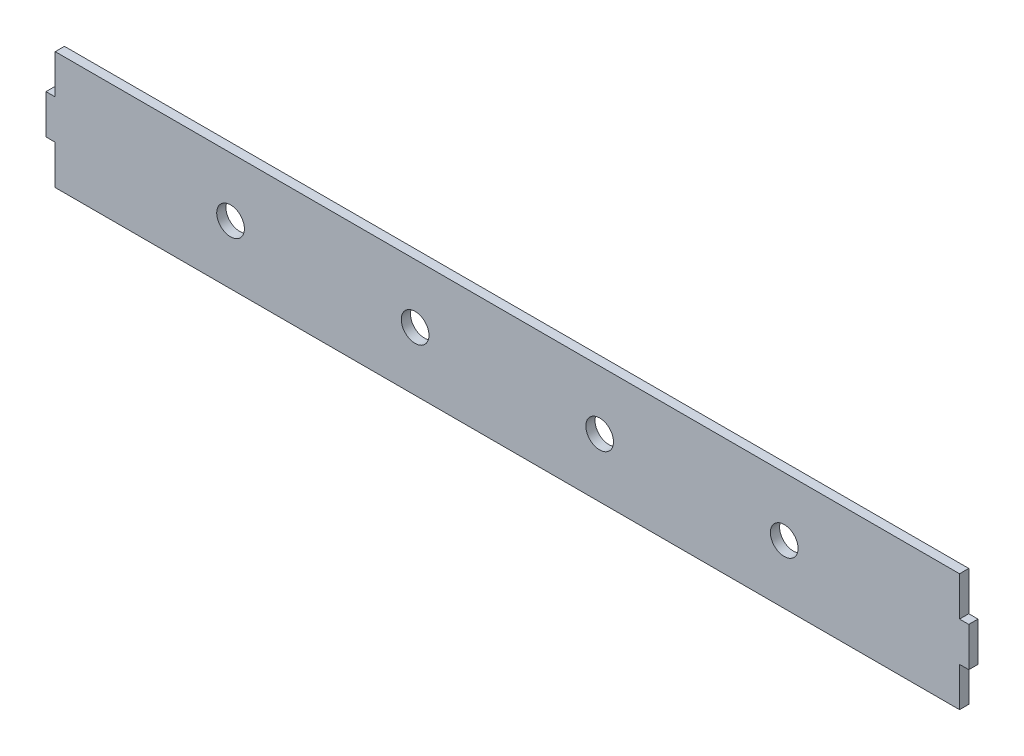
ISO-10303-21;
HEADER;
FILE_DESCRIPTION(('STEP AP214'),'2;1');
FILE_NAME('part.step','',(''),(''),'','','');
FILE_SCHEMA(('AUTOMOTIVE_DESIGN { 1 0 10303 214 1 1 1 1 }'));
ENDSEC;
DATA;
#1=APPLICATION_CONTEXT('core data for automotive mechanical design processes');
#2=APPLICATION_PROTOCOL_DEFINITION('international standard','automotive_design',2000,#1);
#3=PRODUCT_CONTEXT('',#1,'mechanical');
#4=PRODUCT('Part','Part','',(#3));
#5=PRODUCT_RELATED_PRODUCT_CATEGORY('part','',(#4));
#6=PRODUCT_DEFINITION_FORMATION('','',#4);
#7=PRODUCT_DEFINITION_CONTEXT('part definition',#1,'design');
#8=PRODUCT_DEFINITION('design','',#6,#7);
#9=PRODUCT_DEFINITION_SHAPE('','',#8);
#10=(LENGTH_UNIT() NAMED_UNIT(*) SI_UNIT(.MILLI.,.METRE.));
#11=(NAMED_UNIT(*) PLANE_ANGLE_UNIT() SI_UNIT($,.RADIAN.));
#12=(NAMED_UNIT(*) SI_UNIT($,.STERADIAN.) SOLID_ANGLE_UNIT());
#13=UNCERTAINTY_MEASURE_WITH_UNIT(LENGTH_MEASURE(1.E-05),#10,'distance_accuracy_value','');
#14=(GEOMETRIC_REPRESENTATION_CONTEXT(3) GLOBAL_UNCERTAINTY_ASSIGNED_CONTEXT((#13)) GLOBAL_UNIT_ASSIGNED_CONTEXT((#10,
#11,#12)) REPRESENTATION_CONTEXT('',''));
#15=CARTESIAN_POINT('',(0.,0.,0.));
#16=DIRECTION('',(0.,0.,1.));
#17=DIRECTION('',(1.,0.,0.));
#18=AXIS2_PLACEMENT_3D('',#15,#16,#17);
#19=CARTESIAN_POINT('',(0.,0.,5.));
#20=DIRECTION('',(0.,0.,-1.));
#21=DIRECTION('',(-1.,0.,0.));
#22=AXIS2_PLACEMENT_3D('',#19,#20,#21);
#23=PLANE('',#22);
#24=DIRECTION('',(1.,0.,0.));
#25=VECTOR('',#24,1.);
#26=CARTESIAN_POINT('',(490.,0.,5.));
#27=LINE('',#26,#25);
#28=CARTESIAN_POINT('',(0.,0.,5.));
#29=VERTEX_POINT('',#28);
#30=CARTESIAN_POINT('',(490.,0.,5.));
#31=VERTEX_POINT('',#30);
#32=EDGE_CURVE('E180',#29,#31,#27,.T.);
#33=ORIENTED_EDGE('',*,*,#32,.T.);
#34=DIRECTION('',(0.,1.,0.));
#35=VECTOR('',#34,1.);
#36=CARTESIAN_POINT('',(490.,21.2666666666667,5.));
#37=LINE('',#36,#35);
#38=CARTESIAN_POINT('',(490.,21.2666666666667,5.));
#39=VERTEX_POINT('',#38);
#40=EDGE_CURVE('E108',#31,#39,#37,.T.);
#41=ORIENTED_EDGE('',*,*,#40,.T.);
#42=DIRECTION('',(1.,0.,0.));
#43=VECTOR('',#42,1.);
#44=CARTESIAN_POINT('',(495.,21.2666666666667,5.));
#45=LINE('',#44,#43);
#46=CARTESIAN_POINT('',(495.,21.2666666666667,5.));
#47=VERTEX_POINT('',#46);
#48=EDGE_CURVE('E207',#39,#47,#45,.T.);
#49=ORIENTED_EDGE('',*,*,#48,.T.);
#50=DIRECTION('',(0.,1.,0.));
#51=VECTOR('',#50,1.);
#52=CARTESIAN_POINT('',(495.,42.5333333333333,5.));
#53=LINE('',#52,#51);
#54=CARTESIAN_POINT('',(495.,42.5333333333333,5.));
#55=VERTEX_POINT('',#54);
#56=EDGE_CURVE('E226',#47,#55,#53,.T.);
#57=ORIENTED_EDGE('',*,*,#56,.T.);
#58=DIRECTION('',(-1.,0.,0.));
#59=VECTOR('',#58,1.);
#60=CARTESIAN_POINT('',(490.,42.5333333333333,5.));
#61=LINE('',#60,#59);
#62=CARTESIAN_POINT('',(490.,42.5333333333333,5.));
#63=VERTEX_POINT('',#62);
#64=EDGE_CURVE('E223',#55,#63,#61,.T.);
#65=ORIENTED_EDGE('',*,*,#64,.T.);
#66=DIRECTION('',(0.,1.,0.));
#67=VECTOR('',#66,1.);
#68=CARTESIAN_POINT('',(490.,63.7999999999999,5.));
#69=LINE('',#68,#67);
#70=CARTESIAN_POINT('',(490.,63.7999999999999,5.));
#71=VERTEX_POINT('',#70);
#72=EDGE_CURVE('E225',#63,#71,#69,.T.);
#73=ORIENTED_EDGE('',*,*,#72,.T.);
#74=DIRECTION('',(-1.,0.,0.));
#75=VECTOR('',#74,1.);
#76=CARTESIAN_POINT('',(0.,63.7999999999999,5.));
#77=LINE('',#76,#75);
#78=CARTESIAN_POINT('',(0.,63.7999999999999,5.));
#79=VERTEX_POINT('',#78);
#80=EDGE_CURVE('E228',#71,#79,#77,.T.);
#81=ORIENTED_EDGE('',*,*,#80,.T.);
#82=DIRECTION('',(0.,-1.,0.));
#83=VECTOR('',#82,1.);
#84=CARTESIAN_POINT('',(0.,42.5333333333333,5.));
#85=LINE('',#84,#83);
#86=CARTESIAN_POINT('',(0.,42.5333333333333,5.));
#87=VERTEX_POINT('',#86);
#88=EDGE_CURVE('E234',#79,#87,#85,.T.);
#89=ORIENTED_EDGE('',*,*,#88,.T.);
#90=DIRECTION('',(-1.,0.,0.));
#91=VECTOR('',#90,1.);
#92=CARTESIAN_POINT('',(-5.,42.5333333333333,5.));
#93=LINE('',#92,#91);
#94=CARTESIAN_POINT('',(-5.,42.5333333333333,5.));
#95=VERTEX_POINT('',#94);
#96=EDGE_CURVE('E139',#87,#95,#93,.T.);
#97=ORIENTED_EDGE('',*,*,#96,.T.);
#98=DIRECTION('',(0.,-1.,0.));
#99=VECTOR('',#98,1.);
#100=CARTESIAN_POINT('',(-5.,21.2666666666667,5.));
#101=LINE('',#100,#99);
#102=CARTESIAN_POINT('',(-5.,21.2666666666667,5.));
#103=VERTEX_POINT('',#102);
#104=EDGE_CURVE('E133',#95,#103,#101,.T.);
#105=ORIENTED_EDGE('',*,*,#104,.T.);
#106=DIRECTION('',(1.,0.,0.));
#107=VECTOR('',#106,1.);
#108=CARTESIAN_POINT('',(0.,21.2666666666667,5.));
#109=LINE('',#108,#107);
#110=CARTESIAN_POINT('',(0.,21.2666666666667,5.));
#111=VERTEX_POINT('',#110);
#112=EDGE_CURVE('E137',#103,#111,#109,.T.);
#113=ORIENTED_EDGE('',*,*,#112,.T.);
#114=DIRECTION('',(0.,-1.,0.));
#115=VECTOR('',#114,1.);
#116=CARTESIAN_POINT('',(0.,0.,5.));
#117=LINE('',#116,#115);
#118=EDGE_CURVE('E53',#111,#29,#117,.T.);
#119=ORIENTED_EDGE('',*,*,#118,.T.);
#120=EDGE_LOOP('',(#33,#41,#49,#57,#65,#73,#81,#89,#97,#105,#113,#119));
#121=FACE_BOUND('',#120,.T.);
#122=CARTESIAN_POINT('',(95.,31.9,5.));
#123=DIRECTION('',(0.,0.,1.));
#124=DIRECTION('',(1.,0.,0.));
#125=AXIS2_PLACEMENT_3D('',#122,#123,#124);
#126=CIRCLE('',#125,7.50000000000001);
#127=CARTESIAN_POINT('',(102.5,31.9,5.));
#128=VERTEX_POINT('',#127);
#129=EDGE_CURVE('E161',#128,#128,#126,.T.);
#130=ORIENTED_EDGE('',*,*,#129,.F.);
#131=EDGE_LOOP('',(#130));
#132=FACE_BOUND('',#131,.T.);
#133=CARTESIAN_POINT('',(195.,31.9,5.));
#134=DIRECTION('',(0.,0.,1.));
#135=DIRECTION('',(1.,0.,0.));
#136=AXIS2_PLACEMENT_3D('',#133,#134,#135);
#137=CIRCLE('',#136,7.50000000000001);
#138=CARTESIAN_POINT('',(202.5,31.9,5.));
#139=VERTEX_POINT('',#138);
#140=EDGE_CURVE('E298',#139,#139,#137,.T.);
#141=ORIENTED_EDGE('',*,*,#140,.F.);
#142=EDGE_LOOP('',(#141));
#143=FACE_BOUND('',#142,.T.);
#144=CARTESIAN_POINT('',(295.,31.9,5.));
#145=DIRECTION('',(0.,0.,1.));
#146=DIRECTION('',(1.,0.,0.));
#147=AXIS2_PLACEMENT_3D('',#144,#145,#146);
#148=CIRCLE('',#147,7.50000000000001);
#149=CARTESIAN_POINT('',(302.5,31.9,5.));
#150=VERTEX_POINT('',#149);
#151=EDGE_CURVE('E292',#150,#150,#148,.T.);
#152=ORIENTED_EDGE('',*,*,#151,.F.);
#153=EDGE_LOOP('',(#152));
#154=FACE_BOUND('',#153,.T.);
#155=CARTESIAN_POINT('',(395.,31.9,5.));
#156=DIRECTION('',(0.,0.,1.));
#157=DIRECTION('',(1.,0.,0.));
#158=AXIS2_PLACEMENT_3D('',#155,#156,#157);
#159=CIRCLE('',#158,7.50000000000001);
#160=CARTESIAN_POINT('',(402.5,31.9,5.));
#161=VERTEX_POINT('',#160);
#162=EDGE_CURVE('E283',#161,#161,#159,.T.);
#163=ORIENTED_EDGE('',*,*,#162,.F.);
#164=EDGE_LOOP('',(#163));
#165=FACE_BOUND('',#164,.T.);
#166=ADVANCED_FACE('F36',(#121,#132,#143,#154,#165),#23,.F.);
#167=CARTESIAN_POINT('',(0.,0.,0.));
#168=DIRECTION('',(0.,0.,-1.));
#169=DIRECTION('',(-1.,0.,0.));
#170=AXIS2_PLACEMENT_3D('',#167,#168,#169);
#171=PLANE('',#170);
#172=CARTESIAN_POINT('',(295.,31.9,0.));
#173=DIRECTION('',(0.,0.,1.));
#174=DIRECTION('',(1.,0.,0.));
#175=AXIS2_PLACEMENT_3D('',#172,#173,#174);
#176=CIRCLE('',#175,7.50000000000001);
#177=CARTESIAN_POINT('',(302.5,31.9,0.));
#178=VERTEX_POINT('',#177);
#179=EDGE_CURVE('E289',#178,#178,#176,.T.);
#180=ORIENTED_EDGE('',*,*,#179,.T.);
#181=EDGE_LOOP('',(#180));
#182=FACE_BOUND('',#181,.T.);
#183=CARTESIAN_POINT('',(95.,31.9,0.));
#184=DIRECTION('',(0.,0.,1.));
#185=DIRECTION('',(1.,0.,0.));
#186=AXIS2_PLACEMENT_3D('',#183,#184,#185);
#187=CIRCLE('',#186,7.50000000000001);
#188=CARTESIAN_POINT('',(102.5,31.9,0.));
#189=VERTEX_POINT('',#188);
#190=EDGE_CURVE('E301',#189,#189,#187,.T.);
#191=ORIENTED_EDGE('',*,*,#190,.T.);
#192=EDGE_LOOP('',(#191));
#193=FACE_BOUND('',#192,.T.);
#194=DIRECTION('',(1.,0.,0.));
#195=VECTOR('',#194,1.);
#196=CARTESIAN_POINT('',(490.,0.,0.));
#197=LINE('',#196,#195);
#198=CARTESIAN_POINT('',(0.,0.,0.));
#199=VERTEX_POINT('',#198);
#200=CARTESIAN_POINT('',(490.,0.,0.));
#201=VERTEX_POINT('',#200);
#202=EDGE_CURVE('E157',#199,#201,#197,.T.);
#203=ORIENTED_EDGE('',*,*,#202,.F.);
#204=DIRECTION('',(0.,-1.,0.));
#205=VECTOR('',#204,1.);
#206=CARTESIAN_POINT('',(0.,0.,0.));
#207=LINE('',#206,#205);
#208=CARTESIAN_POINT('',(0.,21.2666666666667,0.));
#209=VERTEX_POINT('',#208);
#210=EDGE_CURVE('E100',#209,#199,#207,.T.);
#211=ORIENTED_EDGE('',*,*,#210,.F.);
#212=DIRECTION('',(1.,0.,0.));
#213=VECTOR('',#212,1.);
#214=CARTESIAN_POINT('',(0.,21.2666666666667,0.));
#215=LINE('',#214,#213);
#216=CARTESIAN_POINT('',(-5.,21.2666666666667,0.));
#217=VERTEX_POINT('',#216);
#218=EDGE_CURVE('E94',#217,#209,#215,.T.);
#219=ORIENTED_EDGE('',*,*,#218,.F.);
#220=DIRECTION('',(0.,-1.,0.));
#221=VECTOR('',#220,1.);
#222=CARTESIAN_POINT('',(-5.,21.2666666666667,0.));
#223=LINE('',#222,#221);
#224=CARTESIAN_POINT('',(-5.,42.5333333333333,0.));
#225=VERTEX_POINT('',#224);
#226=EDGE_CURVE('E147',#225,#217,#223,.T.);
#227=ORIENTED_EDGE('',*,*,#226,.F.);
#228=DIRECTION('',(-1.,0.,0.));
#229=VECTOR('',#228,1.);
#230=CARTESIAN_POINT('',(-5.,42.5333333333333,0.));
#231=LINE('',#230,#229);
#232=CARTESIAN_POINT('',(0.,42.5333333333333,0.));
#233=VERTEX_POINT('',#232);
#234=EDGE_CURVE('E175',#233,#225,#231,.T.);
#235=ORIENTED_EDGE('',*,*,#234,.F.);
#236=DIRECTION('',(0.,-1.,0.));
#237=VECTOR('',#236,1.);
#238=CARTESIAN_POINT('',(0.,42.5333333333333,0.));
#239=LINE('',#238,#237);
#240=CARTESIAN_POINT('',(0.,63.7999999999999,0.));
#241=VERTEX_POINT('',#240);
#242=EDGE_CURVE('E173',#241,#233,#239,.T.);
#243=ORIENTED_EDGE('',*,*,#242,.F.);
#244=DIRECTION('',(-1.,0.,0.));
#245=VECTOR('',#244,1.);
#246=CARTESIAN_POINT('',(0.,63.7999999999999,0.));
#247=LINE('',#246,#245);
#248=CARTESIAN_POINT('',(490.,63.7999999999999,0.));
#249=VERTEX_POINT('',#248);
#250=EDGE_CURVE('E171',#249,#241,#247,.T.);
#251=ORIENTED_EDGE('',*,*,#250,.F.);
#252=DIRECTION('',(0.,1.,0.));
#253=VECTOR('',#252,1.);
#254=CARTESIAN_POINT('',(490.,63.7999999999999,0.));
#255=LINE('',#254,#253);
#256=CARTESIAN_POINT('',(490.,42.5333333333333,0.));
#257=VERTEX_POINT('',#256);
#258=EDGE_CURVE('E169',#257,#249,#255,.T.);
#259=ORIENTED_EDGE('',*,*,#258,.F.);
#260=DIRECTION('',(-1.,0.,0.));
#261=VECTOR('',#260,1.);
#262=CARTESIAN_POINT('',(490.,42.5333333333333,0.));
#263=LINE('',#262,#261);
#264=CARTESIAN_POINT('',(495.,42.5333333333333,0.));
#265=VERTEX_POINT('',#264);
#266=EDGE_CURVE('E167',#265,#257,#263,.T.);
#267=ORIENTED_EDGE('',*,*,#266,.F.);
#268=DIRECTION('',(0.,1.,0.));
#269=VECTOR('',#268,1.);
#270=CARTESIAN_POINT('',(495.,42.5333333333333,0.));
#271=LINE('',#270,#269);
#272=CARTESIAN_POINT('',(495.,21.2666666666667,0.));
#273=VERTEX_POINT('',#272);
#274=EDGE_CURVE('E165',#273,#265,#271,.T.);
#275=ORIENTED_EDGE('',*,*,#274,.F.);
#276=DIRECTION('',(1.,0.,0.));
#277=VECTOR('',#276,1.);
#278=CARTESIAN_POINT('',(495.,21.2666666666667,0.));
#279=LINE('',#278,#277);
#280=CARTESIAN_POINT('',(490.,21.2666666666667,0.));
#281=VERTEX_POINT('',#280);
#282=EDGE_CURVE('E163',#281,#273,#279,.T.);
#283=ORIENTED_EDGE('',*,*,#282,.F.);
#284=DIRECTION('',(0.,1.,0.));
#285=VECTOR('',#284,1.);
#286=CARTESIAN_POINT('',(490.,21.2666666666667,0.));
#287=LINE('',#286,#285);
#288=EDGE_CURVE('E160',#201,#281,#287,.T.);
#289=ORIENTED_EDGE('',*,*,#288,.F.);
#290=EDGE_LOOP('',(#203,#211,#219,#227,#235,#243,#251,#259,#267,#275,#283,#289));
#291=FACE_BOUND('',#290,.T.);
#292=CARTESIAN_POINT('',(195.,31.9,0.));
#293=DIRECTION('',(0.,0.,1.));
#294=DIRECTION('',(1.,0.,0.));
#295=AXIS2_PLACEMENT_3D('',#292,#293,#294);
#296=CIRCLE('',#295,7.50000000000001);
#297=CARTESIAN_POINT('',(202.5,31.9,0.));
#298=VERTEX_POINT('',#297);
#299=EDGE_CURVE('E295',#298,#298,#296,.T.);
#300=ORIENTED_EDGE('',*,*,#299,.T.);
#301=EDGE_LOOP('',(#300));
#302=FACE_BOUND('',#301,.T.);
#303=CARTESIAN_POINT('',(395.,31.9,0.));
#304=DIRECTION('',(0.,0.,1.));
#305=DIRECTION('',(1.,0.,0.));
#306=AXIS2_PLACEMENT_3D('',#303,#304,#305);
#307=CIRCLE('',#306,7.50000000000001);
#308=CARTESIAN_POINT('',(402.5,31.9,0.));
#309=VERTEX_POINT('',#308);
#310=EDGE_CURVE('E286',#309,#309,#307,.T.);
#311=ORIENTED_EDGE('',*,*,#310,.T.);
#312=EDGE_LOOP('',(#311));
#313=FACE_BOUND('',#312,.T.);
#314=ADVANCED_FACE('F211',(#182,#193,#291,#302,#313),#171,.T.);
#315=CARTESIAN_POINT('',(490.,0.,5.));
#316=DIRECTION('',(0.,1.,0.));
#317=DIRECTION('',(0.,0.,1.));
#318=AXIS2_PLACEMENT_3D('',#315,#316,#317);
#319=PLANE('',#318);
#320=ORIENTED_EDGE('',*,*,#202,.T.);
#321=DIRECTION('',(0.,0.,-1.));
#322=VECTOR('',#321,1.);
#323=CARTESIAN_POINT('',(490.,0.,5.));
#324=LINE('',#323,#322);
#325=EDGE_CURVE('E11',#31,#201,#324,.T.);
#326=ORIENTED_EDGE('',*,*,#325,.F.);
#327=ORIENTED_EDGE('',*,*,#32,.F.);
#328=DIRECTION('',(0.,0.,-1.));
#329=VECTOR('',#328,1.);
#330=CARTESIAN_POINT('',(0.,0.,5.));
#331=LINE('',#330,#329);
#332=EDGE_CURVE('E153',#29,#199,#331,.T.);
#333=ORIENTED_EDGE('',*,*,#332,.T.);
#334=EDGE_LOOP('',(#320,#326,#327,#333));
#335=FACE_BOUND('',#334,.T.);
#336=ADVANCED_FACE('F38',(#335),#319,.F.);
#337=CARTESIAN_POINT('',(490.,21.2666666666667,5.));
#338=DIRECTION('',(-1.,0.,0.));
#339=DIRECTION('',(0.,0.,1.));
#340=AXIS2_PLACEMENT_3D('',#337,#338,#339);
#341=PLANE('',#340);
#342=ORIENTED_EDGE('',*,*,#288,.T.);
#343=DIRECTION('',(0.,0.,-1.));
#344=VECTOR('',#343,1.);
#345=CARTESIAN_POINT('',(490.,21.2666666666667,5.));
#346=LINE('',#345,#344);
#347=EDGE_CURVE('E45',#39,#281,#346,.T.);
#348=ORIENTED_EDGE('',*,*,#347,.F.);
#349=ORIENTED_EDGE('',*,*,#40,.F.);
#350=ORIENTED_EDGE('',*,*,#325,.T.);
#351=EDGE_LOOP('',(#342,#348,#349,#350));
#352=FACE_BOUND('',#351,.T.);
#353=ADVANCED_FACE('F413',(#352),#341,.F.);
#354=CARTESIAN_POINT('',(495.,21.2666666666667,5.));
#355=DIRECTION('',(0.,1.,0.));
#356=DIRECTION('',(0.,0.,1.));
#357=AXIS2_PLACEMENT_3D('',#354,#355,#356);
#358=PLANE('',#357);
#359=ORIENTED_EDGE('',*,*,#282,.T.);
#360=DIRECTION('',(0.,0.,-1.));
#361=VECTOR('',#360,1.);
#362=CARTESIAN_POINT('',(495.,21.2666666666667,5.));
#363=LINE('',#362,#361);
#364=EDGE_CURVE('E199',#47,#273,#363,.T.);
#365=ORIENTED_EDGE('',*,*,#364,.F.);
#366=ORIENTED_EDGE('',*,*,#48,.F.);
#367=ORIENTED_EDGE('',*,*,#347,.T.);
#368=EDGE_LOOP('',(#359,#365,#366,#367));
#369=FACE_BOUND('',#368,.T.);
#370=ADVANCED_FACE('F205',(#369),#358,.F.);
#371=CARTESIAN_POINT('',(495.,42.5333333333333,5.));
#372=DIRECTION('',(-1.,0.,0.));
#373=DIRECTION('',(0.,0.,1.));
#374=AXIS2_PLACEMENT_3D('',#371,#372,#373);
#375=PLANE('',#374);
#376=ORIENTED_EDGE('',*,*,#274,.T.);
#377=DIRECTION('',(0.,0.,-1.));
#378=VECTOR('',#377,1.);
#379=CARTESIAN_POINT('',(495.,42.5333333333333,5.));
#380=LINE('',#379,#378);
#381=EDGE_CURVE('E196',#55,#265,#380,.T.);
#382=ORIENTED_EDGE('',*,*,#381,.F.);
#383=ORIENTED_EDGE('',*,*,#56,.F.);
#384=ORIENTED_EDGE('',*,*,#364,.T.);
#385=EDGE_LOOP('',(#376,#382,#383,#384));
#386=FACE_BOUND('',#385,.T.);
#387=ADVANCED_FACE('F217',(#386),#375,.F.);
#388=CARTESIAN_POINT('',(490.,42.5333333333333,5.));
#389=DIRECTION('',(0.,-1.,0.));
#390=DIRECTION('',(0.,0.,-1.));
#391=AXIS2_PLACEMENT_3D('',#388,#389,#390);
#392=PLANE('',#391);
#393=ORIENTED_EDGE('',*,*,#266,.T.);
#394=DIRECTION('',(0.,0.,-1.));
#395=VECTOR('',#394,1.);
#396=CARTESIAN_POINT('',(490.,42.5333333333333,5.));
#397=LINE('',#396,#395);
#398=EDGE_CURVE('E193',#63,#257,#397,.T.);
#399=ORIENTED_EDGE('',*,*,#398,.F.);
#400=ORIENTED_EDGE('',*,*,#64,.F.);
#401=ORIENTED_EDGE('',*,*,#381,.T.);
#402=EDGE_LOOP('',(#393,#399,#400,#401));
#403=FACE_BOUND('',#402,.T.);
#404=ADVANCED_FACE('F221',(#403),#392,.F.);
#405=CARTESIAN_POINT('',(490.,63.7999999999999,5.));
#406=DIRECTION('',(-1.,0.,0.));
#407=DIRECTION('',(0.,0.,1.));
#408=AXIS2_PLACEMENT_3D('',#405,#406,#407);
#409=PLANE('',#408);
#410=ORIENTED_EDGE('',*,*,#258,.T.);
#411=DIRECTION('',(0.,0.,-1.));
#412=VECTOR('',#411,1.);
#413=CARTESIAN_POINT('',(490.,63.7999999999999,5.));
#414=LINE('',#413,#412);
#415=EDGE_CURVE('E190',#71,#249,#414,.T.);
#416=ORIENTED_EDGE('',*,*,#415,.F.);
#417=ORIENTED_EDGE('',*,*,#72,.F.);
#418=ORIENTED_EDGE('',*,*,#398,.T.);
#419=EDGE_LOOP('',(#410,#416,#417,#418));
#420=FACE_BOUND('',#419,.T.);
#421=ADVANCED_FACE('F378',(#420),#409,.F.);
#422=CARTESIAN_POINT('',(0.,63.7999999999999,5.));
#423=DIRECTION('',(0.,-1.,0.));
#424=DIRECTION('',(0.,0.,-1.));
#425=AXIS2_PLACEMENT_3D('',#422,#423,#424);
#426=PLANE('',#425);
#427=ORIENTED_EDGE('',*,*,#250,.T.);
#428=DIRECTION('',(0.,0.,-1.));
#429=VECTOR('',#428,1.);
#430=CARTESIAN_POINT('',(0.,63.7999999999999,5.));
#431=LINE('',#430,#429);
#432=EDGE_CURVE('E187',#79,#241,#431,.T.);
#433=ORIENTED_EDGE('',*,*,#432,.F.);
#434=ORIENTED_EDGE('',*,*,#80,.F.);
#435=ORIENTED_EDGE('',*,*,#415,.T.);
#436=EDGE_LOOP('',(#427,#433,#434,#435));
#437=FACE_BOUND('',#436,.T.);
#438=ADVANCED_FACE('F369',(#437),#426,.F.);
#439=CARTESIAN_POINT('',(0.,42.5333333333333,5.));
#440=DIRECTION('',(1.,0.,0.));
#441=DIRECTION('',(0.,0.,-1.));
#442=AXIS2_PLACEMENT_3D('',#439,#440,#441);
#443=PLANE('',#442);
#444=ORIENTED_EDGE('',*,*,#242,.T.);
#445=DIRECTION('',(0.,0.,-1.));
#446=VECTOR('',#445,1.);
#447=CARTESIAN_POINT('',(0.,42.5333333333333,5.));
#448=LINE('',#447,#446);
#449=EDGE_CURVE('E184',#87,#233,#448,.T.);
#450=ORIENTED_EDGE('',*,*,#449,.F.);
#451=ORIENTED_EDGE('',*,*,#88,.F.);
#452=ORIENTED_EDGE('',*,*,#432,.T.);
#453=EDGE_LOOP('',(#444,#450,#451,#452));
#454=FACE_BOUND('',#453,.T.);
#455=ADVANCED_FACE('F240',(#454),#443,.F.);
#456=CARTESIAN_POINT('',(-5.,42.5333333333333,5.));
#457=DIRECTION('',(0.,-1.,0.));
#458=DIRECTION('',(0.,0.,-1.));
#459=AXIS2_PLACEMENT_3D('',#456,#457,#458);
#460=PLANE('',#459);
#461=ORIENTED_EDGE('',*,*,#234,.T.);
#462=DIRECTION('',(0.,0.,-1.));
#463=VECTOR('',#462,1.);
#464=CARTESIAN_POINT('',(-5.,42.5333333333333,5.));
#465=LINE('',#464,#463);
#466=EDGE_CURVE('E148',#95,#225,#465,.T.);
#467=ORIENTED_EDGE('',*,*,#466,.F.);
#468=ORIENTED_EDGE('',*,*,#96,.F.);
#469=ORIENTED_EDGE('',*,*,#449,.T.);
#470=EDGE_LOOP('',(#461,#467,#468,#469));
#471=FACE_BOUND('',#470,.T.);
#472=ADVANCED_FACE('F244',(#471),#460,.F.);
#473=CARTESIAN_POINT('',(-5.,21.2666666666667,5.));
#474=DIRECTION('',(1.,0.,0.));
#475=DIRECTION('',(0.,0.,-1.));
#476=AXIS2_PLACEMENT_3D('',#473,#474,#475);
#477=PLANE('',#476);
#478=ORIENTED_EDGE('',*,*,#226,.T.);
#479=DIRECTION('',(0.,0.,-1.));
#480=VECTOR('',#479,1.);
#481=CARTESIAN_POINT('',(-5.,21.2666666666667,5.));
#482=LINE('',#481,#480);
#483=EDGE_CURVE('E144',#103,#217,#482,.T.);
#484=ORIENTED_EDGE('',*,*,#483,.F.);
#485=ORIENTED_EDGE('',*,*,#104,.F.);
#486=ORIENTED_EDGE('',*,*,#466,.T.);
#487=EDGE_LOOP('',(#478,#484,#485,#486));
#488=FACE_BOUND('',#487,.T.);
#489=ADVANCED_FACE('F145',(#488),#477,.F.);
#490=CARTESIAN_POINT('',(0.,21.2666666666667,5.));
#491=DIRECTION('',(0.,1.,0.));
#492=DIRECTION('',(0.,0.,1.));
#493=AXIS2_PLACEMENT_3D('',#490,#491,#492);
#494=PLANE('',#493);
#495=ORIENTED_EDGE('',*,*,#218,.T.);
#496=DIRECTION('',(0.,0.,-1.));
#497=VECTOR('',#496,1.);
#498=CARTESIAN_POINT('',(0.,21.2666666666667,5.));
#499=LINE('',#498,#497);
#500=EDGE_CURVE('E149',#111,#209,#499,.T.);
#501=ORIENTED_EDGE('',*,*,#500,.F.);
#502=ORIENTED_EDGE('',*,*,#112,.F.);
#503=ORIENTED_EDGE('',*,*,#483,.T.);
#504=EDGE_LOOP('',(#495,#501,#502,#503));
#505=FACE_BOUND('',#504,.T.);
#506=ADVANCED_FACE('F151',(#505),#494,.F.);
#507=CARTESIAN_POINT('',(0.,0.,5.));
#508=DIRECTION('',(1.,0.,0.));
#509=DIRECTION('',(0.,0.,-1.));
#510=AXIS2_PLACEMENT_3D('',#507,#508,#509);
#511=PLANE('',#510);
#512=ORIENTED_EDGE('',*,*,#210,.T.);
#513=ORIENTED_EDGE('',*,*,#332,.F.);
#514=ORIENTED_EDGE('',*,*,#118,.F.);
#515=ORIENTED_EDGE('',*,*,#500,.T.);
#516=EDGE_LOOP('',(#512,#513,#514,#515));
#517=FACE_BOUND('',#516,.T.);
#518=ADVANCED_FACE('F248',(#517),#511,.F.);
#519=CARTESIAN_POINT('',(95.,31.9,5.));
#520=DIRECTION('',(0.,0.,-1.));
#521=DIRECTION('',(-1.,0.,0.));
#522=AXIS2_PLACEMENT_3D('',#519,#520,#521);
#523=CYLINDRICAL_SURFACE('',#522,7.50000000000001);
#524=ORIENTED_EDGE('',*,*,#129,.T.);
#525=EDGE_LOOP('',(#524));
#526=FACE_BOUND('',#525,.T.);
#527=ORIENTED_EDGE('',*,*,#190,.F.);
#528=EDGE_LOOP('',(#527));
#529=FACE_BOUND('',#528,.T.);
#530=ADVANCED_FACE('F250',(#526,#529),#523,.F.);
#531=CARTESIAN_POINT('',(195.,31.9,5.));
#532=DIRECTION('',(0.,0.,-1.));
#533=DIRECTION('',(-1.,0.,0.));
#534=AXIS2_PLACEMENT_3D('',#531,#532,#533);
#535=CYLINDRICAL_SURFACE('',#534,7.50000000000001);
#536=ORIENTED_EDGE('',*,*,#140,.T.);
#537=EDGE_LOOP('',(#536));
#538=FACE_BOUND('',#537,.T.);
#539=ORIENTED_EDGE('',*,*,#299,.F.);
#540=EDGE_LOOP('',(#539));
#541=FACE_BOUND('',#540,.T.);
#542=ADVANCED_FACE('F256',(#538,#541),#535,.F.);
#543=CARTESIAN_POINT('',(295.,31.9,5.));
#544=DIRECTION('',(0.,0.,-1.));
#545=DIRECTION('',(-1.,0.,0.));
#546=AXIS2_PLACEMENT_3D('',#543,#544,#545);
#547=CYLINDRICAL_SURFACE('',#546,7.50000000000001);
#548=ORIENTED_EDGE('',*,*,#151,.T.);
#549=EDGE_LOOP('',(#548));
#550=FACE_BOUND('',#549,.T.);
#551=ORIENTED_EDGE('',*,*,#179,.F.);
#552=EDGE_LOOP('',(#551));
#553=FACE_BOUND('',#552,.T.);
#554=ADVANCED_FACE('F270',(#550,#553),#547,.F.);
#555=CARTESIAN_POINT('',(395.,31.9,5.));
#556=DIRECTION('',(0.,0.,-1.));
#557=DIRECTION('',(-1.,0.,0.));
#558=AXIS2_PLACEMENT_3D('',#555,#556,#557);
#559=CYLINDRICAL_SURFACE('',#558,7.50000000000001);
#560=ORIENTED_EDGE('',*,*,#162,.T.);
#561=EDGE_LOOP('',(#560));
#562=FACE_BOUND('',#561,.T.);
#563=ORIENTED_EDGE('',*,*,#310,.F.);
#564=EDGE_LOOP('',(#563));
#565=FACE_BOUND('',#564,.T.);
#566=ADVANCED_FACE('F274',(#562,#565),#559,.F.);
#567=CLOSED_SHELL('',(#166,#314,#336,#353,#370,#387,#404,#421,#438,#455,#472,#489,#506,#518,
#530,#542,#554,#566));
#568=MANIFOLD_SOLID_BREP('B2',#567);
#569=ADVANCED_BREP_SHAPE_REPRESENTATION('',(#18,#568),#14);
#570=SHAPE_DEFINITION_REPRESENTATION(#9,#569);
ENDSEC;
END-ISO-10303-21;
